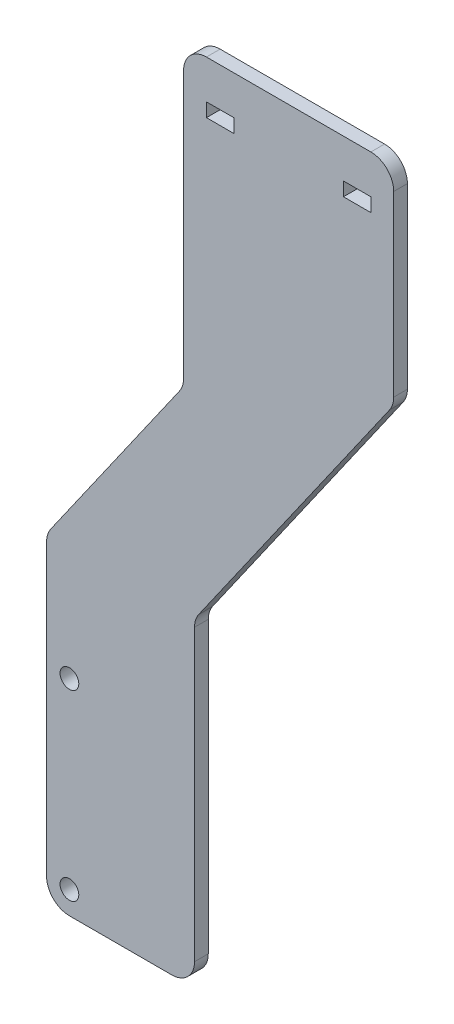
ISO-10303-21;
HEADER;
FILE_DESCRIPTION(('STEP AP214'),'2;1');
FILE_NAME('part.step','',(''),(''),'','','');
FILE_SCHEMA(('AUTOMOTIVE_DESIGN { 1 0 10303 214 1 1 1 1 }'));
ENDSEC;
DATA;
#1=APPLICATION_CONTEXT('core data for automotive mechanical design processes');
#2=APPLICATION_PROTOCOL_DEFINITION('international standard','automotive_design',2000,#1);
#3=PRODUCT_CONTEXT('',#1,'mechanical');
#4=PRODUCT('Part','Part','',(#3));
#5=PRODUCT_RELATED_PRODUCT_CATEGORY('part','',(#4));
#6=PRODUCT_DEFINITION_FORMATION('','',#4);
#7=PRODUCT_DEFINITION_CONTEXT('part definition',#1,'design');
#8=PRODUCT_DEFINITION('design','',#6,#7);
#9=PRODUCT_DEFINITION_SHAPE('','',#8);
#10=(LENGTH_UNIT() NAMED_UNIT(*) SI_UNIT(.MILLI.,.METRE.));
#11=(NAMED_UNIT(*) PLANE_ANGLE_UNIT() SI_UNIT($,.RADIAN.));
#12=(NAMED_UNIT(*) SI_UNIT($,.STERADIAN.) SOLID_ANGLE_UNIT());
#13=UNCERTAINTY_MEASURE_WITH_UNIT(LENGTH_MEASURE(1.E-05),#10,'distance_accuracy_value','');
#14=(GEOMETRIC_REPRESENTATION_CONTEXT(3) GLOBAL_UNCERTAINTY_ASSIGNED_CONTEXT((#13)) GLOBAL_UNIT_ASSIGNED_CONTEXT((#10,
#11,#12)) REPRESENTATION_CONTEXT('',''));
#15=CARTESIAN_POINT('',(0.,0.,0.));
#16=DIRECTION('',(0.,0.,1.));
#17=DIRECTION('',(1.,0.,0.));
#18=AXIS2_PLACEMENT_3D('',#15,#16,#17);
#19=CARTESIAN_POINT('',(0.,0.,3.));
#20=DIRECTION('',(0.,0.,-1.));
#21=DIRECTION('',(-1.,0.,0.));
#22=AXIS2_PLACEMENT_3D('',#19,#20,#21);
#23=PLANE('',#22);
#24=DIRECTION('',(0.,1.,0.));
#25=VECTOR('',#24,1.);
#26=CARTESIAN_POINT('',(-5.00000000000006,158.5,3.));
#27=LINE('',#26,#25);
#28=CARTESIAN_POINT('',(-5.00000000000006,155.5,3.));
#29=VERTEX_POINT('',#28);
#30=CARTESIAN_POINT('',(-5.00000000000006,158.5,3.));
#31=VERTEX_POINT('',#30);
#32=EDGE_CURVE('E237',#29,#31,#27,.T.);
#33=ORIENTED_EDGE('',*,*,#32,.F.);
#34=DIRECTION('',(1.,0.,0.));
#35=VECTOR('',#34,1.);
#36=CARTESIAN_POINT('',(-11.0000000000001,155.5,3.));
#37=LINE('',#36,#35);
#38=CARTESIAN_POINT('',(-11.0000000000001,155.5,3.));
#39=VERTEX_POINT('',#38);
#40=EDGE_CURVE('E245',#39,#29,#37,.T.);
#41=ORIENTED_EDGE('',*,*,#40,.F.);
#42=DIRECTION('',(0.,-1.,0.));
#43=VECTOR('',#42,1.);
#44=CARTESIAN_POINT('',(-11.0000000000001,158.5,3.));
#45=LINE('',#44,#43);
#46=CARTESIAN_POINT('',(-11.0000000000001,158.5,3.));
#47=VERTEX_POINT('',#46);
#48=EDGE_CURVE('E242',#47,#39,#45,.T.);
#49=ORIENTED_EDGE('',*,*,#48,.F.);
#50=DIRECTION('',(-1.,0.,0.));
#51=VECTOR('',#50,1.);
#52=CARTESIAN_POINT('',(-11.0000000000001,158.5,3.));
#53=LINE('',#52,#51);
#54=EDGE_CURVE('E239',#31,#47,#53,.T.);
#55=ORIENTED_EDGE('',*,*,#54,.F.);
#56=EDGE_LOOP('',(#33,#41,#49,#55));
#57=FACE_BOUND('',#56,.T.);
#58=DIRECTION('',(0.573576436351041,0.819152044288995,0.));
#59=VECTOR('',#58,1.);
#60=CARTESIAN_POINT('',(-43.6038327108647,59.155559797736,3.));
#61=LINE('',#60,#59);
#62=CARTESIAN_POINT('',(-42.6995929323097,60.4469480350963,3.));
#63=VERTEX_POINT('',#62);
#64=CARTESIAN_POINT('',(-0.904239778555069,120.136898332715,3.));
#65=VERTEX_POINT('',#64);
#66=EDGE_CURVE('E280',#63,#65,#61,.T.);
#67=ORIENTED_EDGE('',*,*,#66,.T.);
#68=CARTESIAN_POINT('',(-5.00000000000004,123.00478051447,3.));
#69=DIRECTION('',(0.,0.,-1.));
#70=DIRECTION('',(-1.,0.,0.));
#71=AXIS2_PLACEMENT_3D('',#68,#69,#70);
#72=CIRCLE('',#71,5.);
#73=CARTESIAN_POINT('',(0.,123.00478051447,3.));
#74=VERTEX_POINT('',#73);
#75=EDGE_CURVE('E360',#65,#74,#72,.F.);
#76=ORIENTED_EDGE('',*,*,#75,.T.);
#77=DIRECTION('',(0.,1.,0.));
#78=VECTOR('',#77,1.);
#79=CARTESIAN_POINT('',(0.,167.,3.));
#80=LINE('',#79,#78);
#81=CARTESIAN_POINT('',(0.,162.,3.));
#82=VERTEX_POINT('',#81);
#83=EDGE_CURVE('E283',#74,#82,#80,.T.);
#84=ORIENTED_EDGE('',*,*,#83,.T.);
#85=CARTESIAN_POINT('',(-5.00000000000005,162.,3.));
#86=DIRECTION('',(0.,0.,-1.));
#87=DIRECTION('',(-1.,0.,0.));
#88=AXIS2_PLACEMENT_3D('',#85,#86,#87);
#89=CIRCLE('',#88,5.);
#90=CARTESIAN_POINT('',(-5.00000000000005,167.,3.));
#91=VERTEX_POINT('',#90);
#92=EDGE_CURVE('E352',#82,#91,#89,.F.);
#93=ORIENTED_EDGE('',*,*,#92,.T.);
#94=DIRECTION('',(-1.,0.,0.));
#95=VECTOR('',#94,1.);
#96=CARTESIAN_POINT('',(-46.0000000000001,167.,3.));
#97=LINE('',#96,#95);
#98=CARTESIAN_POINT('',(-41.0000000000001,167.,3.));
#99=VERTEX_POINT('',#98);
#100=EDGE_CURVE('E287',#91,#99,#97,.T.);
#101=ORIENTED_EDGE('',*,*,#100,.T.);
#102=CARTESIAN_POINT('',(-41.0000000000001,162.,3.));
#103=DIRECTION('',(0.,0.,-1.));
#104=DIRECTION('',(-1.,0.,0.));
#105=AXIS2_PLACEMENT_3D('',#102,#103,#104);
#106=CIRCLE('',#105,5.);
#107=CARTESIAN_POINT('',(-46.0000000000001,162.,3.));
#108=VERTEX_POINT('',#107);
#109=EDGE_CURVE('E354',#99,#108,#106,.F.);
#110=ORIENTED_EDGE('',*,*,#109,.T.);
#111=DIRECTION('',(0.,-1.,0.));
#112=VECTOR('',#111,1.);
#113=CARTESIAN_POINT('',(-46.0000000000001,102.,3.));
#114=LINE('',#113,#112);
#115=CARTESIAN_POINT('',(-46.0000000000001,103.576493944395,3.));
#116=VERTEX_POINT('',#115);
#117=EDGE_CURVE('E290',#108,#116,#114,.T.);
#118=ORIENTED_EDGE('',*,*,#117,.T.);
#119=CARTESIAN_POINT('',(-51.,103.576493944395,3.));
#120=DIRECTION('',(0.,0.,-1.));
#121=DIRECTION('',(-1.,0.,0.));
#122=AXIS2_PLACEMENT_3D('',#119,#120,#121);
#123=CIRCLE('',#122,5.);
#124=CARTESIAN_POINT('',(-46.9042397785551,100.70861176264,3.));
#125=VERTEX_POINT('',#124);
#126=EDGE_CURVE('E11',#116,#125,#123,.T.);
#127=ORIENTED_EDGE('',*,*,#126,.T.);
#128=DIRECTION('',(-0.573576436351041,-0.819152044288995,0.));
#129=VECTOR('',#128,1.);
#130=CARTESIAN_POINT('',(-46.0000000000001,102.,3.));
#131=LINE('',#130,#129);
#132=CARTESIAN_POINT('',(-75.095760221445,60.4469480350963,3.));
#133=VERTEX_POINT('',#132);
#134=EDGE_CURVE('E293',#125,#133,#131,.T.);
#135=ORIENTED_EDGE('',*,*,#134,.T.);
#136=CARTESIAN_POINT('',(-71.0000000000001,57.5790658533411,3.));
#137=DIRECTION('',(0.,0.,-1.));
#138=DIRECTION('',(-1.,0.,0.));
#139=AXIS2_PLACEMENT_3D('',#136,#137,#138);
#140=CIRCLE('',#139,5.);
#141=CARTESIAN_POINT('',(-76.0000000000001,57.5790658533411,3.));
#142=VERTEX_POINT('',#141);
#143=EDGE_CURVE('E356',#133,#142,#140,.F.);
#144=ORIENTED_EDGE('',*,*,#143,.T.);
#145=DIRECTION('',(0.,-1.,0.));
#146=VECTOR('',#145,1.);
#147=CARTESIAN_POINT('',(-76.0000000000001,-10.844440202264,3.));
#148=LINE('',#147,#146);
#149=CARTESIAN_POINT('',(-76.0000000000001,-5.84444020226398,3.));
#150=VERTEX_POINT('',#149);
#151=EDGE_CURVE('E296',#142,#150,#148,.T.);
#152=ORIENTED_EDGE('',*,*,#151,.T.);
#153=CARTESIAN_POINT('',(-71.0000000000001,-5.84444020226398,3.));
#154=DIRECTION('',(0.,0.,-1.));
#155=DIRECTION('',(-1.,0.,0.));
#156=AXIS2_PLACEMENT_3D('',#153,#154,#155);
#157=CIRCLE('',#156,5.);
#158=CARTESIAN_POINT('',(-71.0000000000001,-10.844440202264,3.));
#159=VERTEX_POINT('',#158);
#160=EDGE_CURVE('E55',#150,#159,#157,.F.);
#161=ORIENTED_EDGE('',*,*,#160,.T.);
#162=DIRECTION('',(1.,0.,0.));
#163=VECTOR('',#162,1.);
#164=CARTESIAN_POINT('',(-43.6038327108647,-10.844440202264,3.));
#165=LINE('',#164,#163);
#166=CARTESIAN_POINT('',(-48.6038327108647,-10.844440202264,3.));
#167=VERTEX_POINT('',#166);
#168=EDGE_CURVE('E298',#159,#167,#165,.T.);
#169=ORIENTED_EDGE('',*,*,#168,.T.);
#170=CARTESIAN_POINT('',(-48.6038327108647,-5.84444020226398,3.));
#171=DIRECTION('',(0.,0.,-1.));
#172=DIRECTION('',(-1.,0.,0.));
#173=AXIS2_PLACEMENT_3D('',#170,#171,#172);
#174=CIRCLE('',#173,5.);
#175=CARTESIAN_POINT('',(-43.6038327108647,-5.84444020226398,3.));
#176=VERTEX_POINT('',#175);
#177=EDGE_CURVE('E358',#167,#176,#174,.F.);
#178=ORIENTED_EDGE('',*,*,#177,.T.);
#179=DIRECTION('',(0.,1.,0.));
#180=VECTOR('',#179,1.);
#181=CARTESIAN_POINT('',(-43.6038327108647,39.7272732276612,3.));
#182=LINE('',#181,#180);
#183=CARTESIAN_POINT('',(-43.6038327108647,57.5790658533411,3.));
#184=VERTEX_POINT('',#183);
#185=EDGE_CURVE('E300',#176,#184,#182,.T.);
#186=ORIENTED_EDGE('',*,*,#185,.T.);
#187=CARTESIAN_POINT('',(-38.6038327108647,57.5790658533411,3.));
#188=DIRECTION('',(0.,0.,-1.));
#189=DIRECTION('',(-1.,0.,0.));
#190=AXIS2_PLACEMENT_3D('',#187,#188,#189);
#191=CIRCLE('',#190,5.);
#192=EDGE_CURVE('E388',#184,#63,#191,.T.);
#193=ORIENTED_EDGE('',*,*,#192,.T.);
#194=EDGE_LOOP('',(#67,#76,#84,#93,#101,#110,#118,#127,#135,#144,#152,#161,#169,#178,#186,#193));
#195=FACE_BOUND('',#194,.T.);
#196=CARTESIAN_POINT('',(-71.,34.155559797736,3.));
#197=DIRECTION('',(0.,0.,1.));
#198=DIRECTION('',(1.,0.,0.));
#199=AXIS2_PLACEMENT_3D('',#196,#197,#198);
#200=CIRCLE('',#199,2.04999999999999);
#201=CARTESIAN_POINT('',(-68.9500000000001,34.155559797736,3.));
#202=VERTEX_POINT('',#201);
#203=EDGE_CURVE('E274',#202,#202,#200,.T.);
#204=ORIENTED_EDGE('',*,*,#203,.F.);
#205=EDGE_LOOP('',(#204));
#206=FACE_BOUND('',#205,.T.);
#207=CARTESIAN_POINT('',(-71.0000000000001,-5.84444020226398,3.));
#208=DIRECTION('',(0.,0.,1.));
#209=DIRECTION('',(1.,0.,0.));
#210=AXIS2_PLACEMENT_3D('',#207,#208,#209);
#211=CIRCLE('',#210,2.05000000000001);
#212=CARTESIAN_POINT('',(-68.9500000000001,-5.84444020226398,3.));
#213=VERTEX_POINT('',#212);
#214=EDGE_CURVE('E268',#213,#213,#211,.T.);
#215=ORIENTED_EDGE('',*,*,#214,.F.);
#216=EDGE_LOOP('',(#215));
#217=FACE_BOUND('',#216,.T.);
#218=DIRECTION('',(-1.,0.,0.));
#219=VECTOR('',#218,1.);
#220=CARTESIAN_POINT('',(-35.0000000000001,158.5,3.));
#221=LINE('',#220,#219);
#222=CARTESIAN_POINT('',(-35.0000000000001,158.5,3.));
#223=VERTEX_POINT('',#222);
#224=CARTESIAN_POINT('',(-41.0000000000001,158.5,3.));
#225=VERTEX_POINT('',#224);
#226=EDGE_CURVE('E196',#223,#225,#221,.T.);
#227=ORIENTED_EDGE('',*,*,#226,.F.);
#228=DIRECTION('',(0.,1.,0.));
#229=VECTOR('',#228,1.);
#230=CARTESIAN_POINT('',(-35.0000000000001,158.5,3.));
#231=LINE('',#230,#229);
#232=CARTESIAN_POINT('',(-35.0000000000001,155.5,3.));
#233=VERTEX_POINT('',#232);
#234=EDGE_CURVE('E221',#233,#223,#231,.T.);
#235=ORIENTED_EDGE('',*,*,#234,.F.);
#236=DIRECTION('',(1.,0.,0.));
#237=VECTOR('',#236,1.);
#238=CARTESIAN_POINT('',(-35.0000000000001,155.5,3.));
#239=LINE('',#238,#237);
#240=CARTESIAN_POINT('',(-41.,155.5,3.));
#241=VERTEX_POINT('',#240);
#242=EDGE_CURVE('E219',#241,#233,#239,.T.);
#243=ORIENTED_EDGE('',*,*,#242,.F.);
#244=DIRECTION('',(0.,-1.,0.));
#245=VECTOR('',#244,1.);
#246=CARTESIAN_POINT('',(-41.0000000000001,158.5,3.));
#247=LINE('',#246,#245);
#248=EDGE_CURVE('E206',#225,#241,#247,.T.);
#249=ORIENTED_EDGE('',*,*,#248,.F.);
#250=EDGE_LOOP('',(#227,#235,#243,#249));
#251=FACE_BOUND('',#250,.T.);
#252=ADVANCED_FACE('F33',(#57,#195,#206,#217,#251),#23,.F.);
#253=CARTESIAN_POINT('',(0.,0.,0.));
#254=DIRECTION('',(0.,0.,-1.));
#255=DIRECTION('',(-1.,0.,0.));
#256=AXIS2_PLACEMENT_3D('',#253,#254,#255);
#257=PLANE('',#256);
#258=CARTESIAN_POINT('',(-71.,34.155559797736,0.));
#259=DIRECTION('',(0.,0.,1.));
#260=DIRECTION('',(1.,0.,0.));
#261=AXIS2_PLACEMENT_3D('',#258,#259,#260);
#262=CIRCLE('',#261,2.04999999999999);
#263=CARTESIAN_POINT('',(-68.9500000000001,34.155559797736,0.));
#264=VERTEX_POINT('',#263);
#265=EDGE_CURVE('E271',#264,#264,#262,.T.);
#266=ORIENTED_EDGE('',*,*,#265,.T.);
#267=EDGE_LOOP('',(#266));
#268=FACE_BOUND('',#267,.T.);
#269=DIRECTION('',(0.,1.,0.));
#270=VECTOR('',#269,1.);
#271=CARTESIAN_POINT('',(0.,167.,0.));
#272=LINE('',#271,#270);
#273=CARTESIAN_POINT('',(0.,123.00478051447,0.));
#274=VERTEX_POINT('',#273);
#275=CARTESIAN_POINT('',(0.,162.,0.));
#276=VERTEX_POINT('',#275);
#277=EDGE_CURVE('E306',#274,#276,#272,.T.);
#278=ORIENTED_EDGE('',*,*,#277,.F.);
#279=CARTESIAN_POINT('',(-5.00000000000004,123.00478051447,0.));
#280=DIRECTION('',(0.,0.,-1.));
#281=DIRECTION('',(-1.,0.,0.));
#282=AXIS2_PLACEMENT_3D('',#279,#280,#281);
#283=CIRCLE('',#282,5.);
#284=CARTESIAN_POINT('',(-0.904239778555069,120.136898332715,0.));
#285=VERTEX_POINT('',#284);
#286=EDGE_CURVE('E349',#274,#285,#283,.T.);
#287=ORIENTED_EDGE('',*,*,#286,.T.);
#288=DIRECTION('',(0.573576436351041,0.819152044288995,0.));
#289=VECTOR('',#288,1.);
#290=CARTESIAN_POINT('',(-43.6038327108647,59.155559797736,0.));
#291=LINE('',#290,#289);
#292=CARTESIAN_POINT('',(-42.6995929323097,60.4469480350963,0.));
#293=VERTEX_POINT('',#292);
#294=EDGE_CURVE('E277',#293,#285,#291,.T.);
#295=ORIENTED_EDGE('',*,*,#294,.F.);
#296=CARTESIAN_POINT('',(-38.6038327108647,57.5790658533411,0.));
#297=DIRECTION('',(0.,0.,-1.));
#298=DIRECTION('',(-1.,0.,0.));
#299=AXIS2_PLACEMENT_3D('',#296,#297,#298);
#300=CIRCLE('',#299,5.);
#301=CARTESIAN_POINT('',(-43.6038327108647,57.5790658533411,0.));
#302=VERTEX_POINT('',#301);
#303=EDGE_CURVE('E386',#293,#302,#300,.F.);
#304=ORIENTED_EDGE('',*,*,#303,.T.);
#305=DIRECTION('',(0.,1.,0.));
#306=VECTOR('',#305,1.);
#307=CARTESIAN_POINT('',(-43.6038327108647,39.7272732276612,0.));
#308=LINE('',#307,#306);
#309=CARTESIAN_POINT('',(-43.6038327108647,-5.84444020226398,0.));
#310=VERTEX_POINT('',#309);
#311=EDGE_CURVE('E284',#310,#302,#308,.T.);
#312=ORIENTED_EDGE('',*,*,#311,.F.);
#313=CARTESIAN_POINT('',(-48.6038327108647,-5.84444020226398,0.));
#314=DIRECTION('',(0.,0.,-1.));
#315=DIRECTION('',(-1.,0.,0.));
#316=AXIS2_PLACEMENT_3D('',#313,#314,#315);
#317=CIRCLE('',#316,5.);
#318=CARTESIAN_POINT('',(-48.6038327108647,-10.844440202264,0.));
#319=VERTEX_POINT('',#318);
#320=EDGE_CURVE('E347',#310,#319,#317,.T.);
#321=ORIENTED_EDGE('',*,*,#320,.T.);
#322=DIRECTION('',(1.,0.,0.));
#323=VECTOR('',#322,1.);
#324=CARTESIAN_POINT('',(-43.6038327108647,-10.844440202264,0.));
#325=LINE('',#324,#323);
#326=CARTESIAN_POINT('',(-71.0000000000001,-10.844440202264,0.));
#327=VERTEX_POINT('',#326);
#328=EDGE_CURVE('E321',#327,#319,#325,.T.);
#329=ORIENTED_EDGE('',*,*,#328,.F.);
#330=CARTESIAN_POINT('',(-71.0000000000001,-5.84444020226398,0.));
#331=DIRECTION('',(0.,0.,-1.));
#332=DIRECTION('',(-1.,0.,0.));
#333=AXIS2_PLACEMENT_3D('',#330,#331,#332);
#334=CIRCLE('',#333,5.);
#335=CARTESIAN_POINT('',(-76.0000000000001,-5.84444020226398,0.));
#336=VERTEX_POINT('',#335);
#337=EDGE_CURVE('E339',#327,#336,#334,.T.);
#338=ORIENTED_EDGE('',*,*,#337,.T.);
#339=DIRECTION('',(0.,-1.,0.));
#340=VECTOR('',#339,1.);
#341=CARTESIAN_POINT('',(-76.0000000000001,-10.844440202264,0.));
#342=LINE('',#341,#340);
#343=CARTESIAN_POINT('',(-76.0000000000001,57.5790658533411,0.));
#344=VERTEX_POINT('',#343);
#345=EDGE_CURVE('E318',#344,#336,#342,.T.);
#346=ORIENTED_EDGE('',*,*,#345,.F.);
#347=CARTESIAN_POINT('',(-71.0000000000001,57.5790658533411,0.));
#348=DIRECTION('',(0.,0.,-1.));
#349=DIRECTION('',(-1.,0.,0.));
#350=AXIS2_PLACEMENT_3D('',#347,#348,#349);
#351=CIRCLE('',#350,5.);
#352=CARTESIAN_POINT('',(-75.095760221445,60.4469480350963,0.));
#353=VERTEX_POINT('',#352);
#354=EDGE_CURVE('E345',#344,#353,#351,.T.);
#355=ORIENTED_EDGE('',*,*,#354,.T.);
#356=DIRECTION('',(-0.573576436351041,-0.819152044288995,0.));
#357=VECTOR('',#356,1.);
#358=CARTESIAN_POINT('',(-46.0000000000001,102.,0.));
#359=LINE('',#358,#357);
#360=CARTESIAN_POINT('',(-46.9042397785551,100.70861176264,0.));
#361=VERTEX_POINT('',#360);
#362=EDGE_CURVE('E315',#361,#353,#359,.T.);
#363=ORIENTED_EDGE('',*,*,#362,.F.);
#364=CARTESIAN_POINT('',(-51.,103.576493944395,0.));
#365=DIRECTION('',(0.,0.,-1.));
#366=DIRECTION('',(-1.,0.,0.));
#367=AXIS2_PLACEMENT_3D('',#364,#365,#366);
#368=CIRCLE('',#367,5.);
#369=CARTESIAN_POINT('',(-46.0000000000001,103.576493944395,0.));
#370=VERTEX_POINT('',#369);
#371=EDGE_CURVE('E41',#361,#370,#368,.F.);
#372=ORIENTED_EDGE('',*,*,#371,.T.);
#373=DIRECTION('',(0.,-1.,0.));
#374=VECTOR('',#373,1.);
#375=CARTESIAN_POINT('',(-46.0000000000001,102.,0.));
#376=LINE('',#375,#374);
#377=CARTESIAN_POINT('',(-46.0000000000001,162.,0.));
#378=VERTEX_POINT('',#377);
#379=EDGE_CURVE('E312',#378,#370,#376,.T.);
#380=ORIENTED_EDGE('',*,*,#379,.F.);
#381=CARTESIAN_POINT('',(-41.0000000000001,162.,0.));
#382=DIRECTION('',(0.,0.,-1.));
#383=DIRECTION('',(-1.,0.,0.));
#384=AXIS2_PLACEMENT_3D('',#381,#382,#383);
#385=CIRCLE('',#384,5.);
#386=CARTESIAN_POINT('',(-41.0000000000001,167.,0.));
#387=VERTEX_POINT('',#386);
#388=EDGE_CURVE('E343',#378,#387,#385,.T.);
#389=ORIENTED_EDGE('',*,*,#388,.T.);
#390=DIRECTION('',(-1.,0.,0.));
#391=VECTOR('',#390,1.);
#392=CARTESIAN_POINT('',(-46.0000000000001,167.,0.));
#393=LINE('',#392,#391);
#394=CARTESIAN_POINT('',(-5.00000000000005,167.,0.));
#395=VERTEX_POINT('',#394);
#396=EDGE_CURVE('E309',#395,#387,#393,.T.);
#397=ORIENTED_EDGE('',*,*,#396,.F.);
#398=CARTESIAN_POINT('',(-5.00000000000005,162.,0.));
#399=DIRECTION('',(0.,0.,-1.));
#400=DIRECTION('',(-1.,0.,0.));
#401=AXIS2_PLACEMENT_3D('',#398,#399,#400);
#402=CIRCLE('',#401,5.);
#403=EDGE_CURVE('E341',#395,#276,#402,.T.);
#404=ORIENTED_EDGE('',*,*,#403,.T.);
#405=EDGE_LOOP('',(#278,#287,#295,#304,#312,#321,#329,#338,#346,#355,#363,#372,#380,#389,#397,#404));
#406=FACE_BOUND('',#405,.T.);
#407=CARTESIAN_POINT('',(-71.0000000000001,-5.84444020226398,0.));
#408=DIRECTION('',(0.,0.,1.));
#409=DIRECTION('',(1.,0.,0.));
#410=AXIS2_PLACEMENT_3D('',#407,#408,#409);
#411=CIRCLE('',#410,2.05000000000001);
#412=CARTESIAN_POINT('',(-68.9500000000001,-5.84444020226398,0.));
#413=VERTEX_POINT('',#412);
#414=EDGE_CURVE('E267',#413,#413,#411,.T.);
#415=ORIENTED_EDGE('',*,*,#414,.T.);
#416=EDGE_LOOP('',(#415));
#417=FACE_BOUND('',#416,.T.);
#418=DIRECTION('',(1.,0.,0.));
#419=VECTOR('',#418,1.);
#420=CARTESIAN_POINT('',(-11.0000000000001,155.5,0.));
#421=LINE('',#420,#419);
#422=CARTESIAN_POINT('',(-11.0000000000001,155.5,0.));
#423=VERTEX_POINT('',#422);
#424=CARTESIAN_POINT('',(-5.00000000000006,155.5,0.));
#425=VERTEX_POINT('',#424);
#426=EDGE_CURVE('E240',#423,#425,#421,.T.);
#427=ORIENTED_EDGE('',*,*,#426,.T.);
#428=DIRECTION('',(0.,1.,0.));
#429=VECTOR('',#428,1.);
#430=CARTESIAN_POINT('',(-5.00000000000006,158.5,0.));
#431=LINE('',#430,#429);
#432=CARTESIAN_POINT('',(-5.00000000000006,158.5,0.));
#433=VERTEX_POINT('',#432);
#434=EDGE_CURVE('E214',#425,#433,#431,.T.);
#435=ORIENTED_EDGE('',*,*,#434,.T.);
#436=DIRECTION('',(-1.,0.,0.));
#437=VECTOR('',#436,1.);
#438=CARTESIAN_POINT('',(-11.0000000000001,158.5,0.));
#439=LINE('',#438,#437);
#440=CARTESIAN_POINT('',(-11.0000000000001,158.5,0.));
#441=VERTEX_POINT('',#440);
#442=EDGE_CURVE('E250',#433,#441,#439,.T.);
#443=ORIENTED_EDGE('',*,*,#442,.T.);
#444=DIRECTION('',(0.,-1.,0.));
#445=VECTOR('',#444,1.);
#446=CARTESIAN_POINT('',(-11.0000000000001,158.5,0.));
#447=LINE('',#446,#445);
#448=EDGE_CURVE('E253',#441,#423,#447,.T.);
#449=ORIENTED_EDGE('',*,*,#448,.T.);
#450=EDGE_LOOP('',(#427,#435,#443,#449));
#451=FACE_BOUND('',#450,.T.);
#452=DIRECTION('',(0.,1.,0.));
#453=VECTOR('',#452,1.);
#454=CARTESIAN_POINT('',(-35.0000000000001,158.5,0.));
#455=LINE('',#454,#453);
#456=CARTESIAN_POINT('',(-35.0000000000001,155.5,0.));
#457=VERTEX_POINT('',#456);
#458=CARTESIAN_POINT('',(-35.0000000000001,158.5,0.));
#459=VERTEX_POINT('',#458);
#460=EDGE_CURVE('E207',#457,#459,#455,.T.);
#461=ORIENTED_EDGE('',*,*,#460,.T.);
#462=DIRECTION('',(-1.,0.,0.));
#463=VECTOR('',#462,1.);
#464=CARTESIAN_POINT('',(-35.0000000000001,158.5,0.));
#465=LINE('',#464,#463);
#466=CARTESIAN_POINT('',(-41.0000000000001,158.5,0.));
#467=VERTEX_POINT('',#466);
#468=EDGE_CURVE('E225',#459,#467,#465,.T.);
#469=ORIENTED_EDGE('',*,*,#468,.T.);
#470=DIRECTION('',(0.,-1.,0.));
#471=VECTOR('',#470,1.);
#472=CARTESIAN_POINT('',(-41.0000000000001,158.5,0.));
#473=LINE('',#472,#471);
#474=CARTESIAN_POINT('',(-41.,155.5,0.));
#475=VERTEX_POINT('',#474);
#476=EDGE_CURVE('E213',#467,#475,#473,.T.);
#477=ORIENTED_EDGE('',*,*,#476,.T.);
#478=DIRECTION('',(1.,0.,0.));
#479=VECTOR('',#478,1.);
#480=CARTESIAN_POINT('',(-35.0000000000001,155.5,0.));
#481=LINE('',#480,#479);
#482=EDGE_CURVE('E228',#475,#457,#481,.T.);
#483=ORIENTED_EDGE('',*,*,#482,.T.);
#484=EDGE_LOOP('',(#461,#469,#477,#483));
#485=FACE_BOUND('',#484,.T.);
#486=ADVANCED_FACE('F393',(#268,#406,#417,#451,#485),#257,.T.);
#487=CARTESIAN_POINT('',(-43.6038327108647,59.155559797736,3.));
#488=DIRECTION('',(-0.819152044288995,0.573576436351041,0.));
#489=DIRECTION('',(-0.573576436351041,-0.819152044288995,0.));
#490=AXIS2_PLACEMENT_3D('',#487,#488,#489);
#491=PLANE('',#490);
#492=ORIENTED_EDGE('',*,*,#66,.F.);
#493=DIRECTION('',(0.,0.,-1.));
#494=VECTOR('',#493,1.);
#495=CARTESIAN_POINT('',(-42.6995929323097,60.4469480350963,0.));
#496=LINE('',#495,#494);
#497=EDGE_CURVE('E326',#63,#293,#496,.T.);
#498=ORIENTED_EDGE('',*,*,#497,.T.);
#499=ORIENTED_EDGE('',*,*,#294,.T.);
#500=DIRECTION('',(0.,0.,-1.));
#501=VECTOR('',#500,1.);
#502=CARTESIAN_POINT('',(-0.904239778555069,120.136898332715,3.));
#503=LINE('',#502,#501);
#504=EDGE_CURVE('E303',#285,#65,#503,.F.);
#505=ORIENTED_EDGE('',*,*,#504,.T.);
#506=EDGE_LOOP('',(#492,#498,#499,#505));
#507=FACE_BOUND('',#506,.T.);
#508=ADVANCED_FACE('F438',(#507),#491,.F.);
#509=CARTESIAN_POINT('',(0.,167.,3.));
#510=DIRECTION('',(-1.,0.,0.));
#511=DIRECTION('',(0.,-1.,0.));
#512=AXIS2_PLACEMENT_3D('',#509,#510,#511);
#513=PLANE('',#512);
#514=ORIENTED_EDGE('',*,*,#83,.F.);
#515=DIRECTION('',(0.,0.,-1.));
#516=VECTOR('',#515,1.);
#517=CARTESIAN_POINT('',(0.,123.00478051447,3.));
#518=LINE('',#517,#516);
#519=EDGE_CURVE('E336',#74,#274,#518,.T.);
#520=ORIENTED_EDGE('',*,*,#519,.T.);
#521=ORIENTED_EDGE('',*,*,#277,.T.);
#522=DIRECTION('',(0.,0.,-1.));
#523=VECTOR('',#522,1.);
#524=CARTESIAN_POINT('',(0.,162.,3.));
#525=LINE('',#524,#523);
#526=EDGE_CURVE('E334',#276,#82,#525,.F.);
#527=ORIENTED_EDGE('',*,*,#526,.T.);
#528=EDGE_LOOP('',(#514,#520,#521,#527));
#529=FACE_BOUND('',#528,.T.);
#530=ADVANCED_FACE('F446',(#529),#513,.F.);
#531=CARTESIAN_POINT('',(-46.0000000000001,167.,3.));
#532=DIRECTION('',(0.,-1.,0.));
#533=DIRECTION('',(0.,0.,-1.));
#534=AXIS2_PLACEMENT_3D('',#531,#532,#533);
#535=PLANE('',#534);
#536=ORIENTED_EDGE('',*,*,#396,.T.);
#537=DIRECTION('',(0.,0.,-1.));
#538=VECTOR('',#537,1.);
#539=CARTESIAN_POINT('',(-41.0000000000001,167.,3.));
#540=LINE('',#539,#538);
#541=EDGE_CURVE('E384',#387,#99,#540,.F.);
#542=ORIENTED_EDGE('',*,*,#541,.T.);
#543=ORIENTED_EDGE('',*,*,#100,.F.);
#544=DIRECTION('',(0.,0.,-1.));
#545=VECTOR('',#544,1.);
#546=CARTESIAN_POINT('',(-5.00000000000005,167.,3.));
#547=LINE('',#546,#545);
#548=EDGE_CURVE('E381',#91,#395,#547,.T.);
#549=ORIENTED_EDGE('',*,*,#548,.T.);
#550=EDGE_LOOP('',(#536,#542,#543,#549));
#551=FACE_BOUND('',#550,.T.);
#552=ADVANCED_FACE('F455',(#551),#535,.F.);
#553=CARTESIAN_POINT('',(-46.0000000000001,102.,3.));
#554=DIRECTION('',(1.,0.,0.));
#555=DIRECTION('',(0.,0.,-1.));
#556=AXIS2_PLACEMENT_3D('',#553,#554,#555);
#557=PLANE('',#556);
#558=ORIENTED_EDGE('',*,*,#379,.T.);
#559=DIRECTION('',(0.,0.,-1.));
#560=VECTOR('',#559,1.);
#561=CARTESIAN_POINT('',(-46.0000000000001,103.576493944395,3.));
#562=LINE('',#561,#560);
#563=EDGE_CURVE('E374',#370,#116,#562,.F.);
#564=ORIENTED_EDGE('',*,*,#563,.T.);
#565=ORIENTED_EDGE('',*,*,#117,.F.);
#566=DIRECTION('',(0.,0.,-1.));
#567=VECTOR('',#566,1.);
#568=CARTESIAN_POINT('',(-46.0000000000001,162.,3.));
#569=LINE('',#568,#567);
#570=EDGE_CURVE('E371',#108,#378,#569,.T.);
#571=ORIENTED_EDGE('',*,*,#570,.T.);
#572=EDGE_LOOP('',(#558,#564,#565,#571));
#573=FACE_BOUND('',#572,.T.);
#574=ADVANCED_FACE('F399',(#573),#557,.F.);
#575=CARTESIAN_POINT('',(-46.0000000000001,102.,3.));
#576=DIRECTION('',(0.819152044288995,-0.573576436351041,0.));
#577=DIRECTION('',(0.573576436351041,0.819152044288995,0.));
#578=AXIS2_PLACEMENT_3D('',#575,#576,#577);
#579=PLANE('',#578);
#580=ORIENTED_EDGE('',*,*,#134,.F.);
#581=DIRECTION('',(0.,0.,-1.));
#582=VECTOR('',#581,1.);
#583=CARTESIAN_POINT('',(-46.9042397785551,100.70861176264,0.));
#584=LINE('',#583,#582);
#585=EDGE_CURVE('E368',#125,#361,#584,.T.);
#586=ORIENTED_EDGE('',*,*,#585,.T.);
#587=ORIENTED_EDGE('',*,*,#362,.T.);
#588=DIRECTION('',(0.,0.,-1.));
#589=VECTOR('',#588,1.);
#590=CARTESIAN_POINT('',(-75.095760221445,60.4469480350963,3.));
#591=LINE('',#590,#589);
#592=EDGE_CURVE('E366',#353,#133,#591,.F.);
#593=ORIENTED_EDGE('',*,*,#592,.T.);
#594=EDGE_LOOP('',(#580,#586,#587,#593));
#595=FACE_BOUND('',#594,.T.);
#596=ADVANCED_FACE('F408',(#595),#579,.F.);
#597=CARTESIAN_POINT('',(-76.0000000000001,-10.844440202264,3.));
#598=DIRECTION('',(1.,0.,0.));
#599=DIRECTION('',(0.,0.,-1.));
#600=AXIS2_PLACEMENT_3D('',#597,#598,#599);
#601=PLANE('',#600);
#602=ORIENTED_EDGE('',*,*,#151,.F.);
#603=DIRECTION('',(0.,0.,-1.));
#604=VECTOR('',#603,1.);
#605=CARTESIAN_POINT('',(-76.0000000000001,57.5790658533411,3.));
#606=LINE('',#605,#604);
#607=EDGE_CURVE('E378',#142,#344,#606,.T.);
#608=ORIENTED_EDGE('',*,*,#607,.T.);
#609=ORIENTED_EDGE('',*,*,#345,.T.);
#610=DIRECTION('',(0.,0.,-1.));
#611=VECTOR('',#610,1.);
#612=CARTESIAN_POINT('',(-76.0000000000001,-5.84444020226398,3.));
#613=LINE('',#612,#611);
#614=EDGE_CURVE('E376',#336,#150,#613,.F.);
#615=ORIENTED_EDGE('',*,*,#614,.T.);
#616=EDGE_LOOP('',(#602,#608,#609,#615));
#617=FACE_BOUND('',#616,.T.);
#618=ADVANCED_FACE('F415',(#617),#601,.F.);
#619=CARTESIAN_POINT('',(-43.6038327108647,-10.844440202264,3.));
#620=DIRECTION('',(0.,1.,0.));
#621=DIRECTION('',(-1.,0.,0.));
#622=AXIS2_PLACEMENT_3D('',#619,#620,#621);
#623=PLANE('',#622);
#624=ORIENTED_EDGE('',*,*,#328,.T.);
#625=DIRECTION('',(0.,0.,-1.));
#626=VECTOR('',#625,1.);
#627=CARTESIAN_POINT('',(-48.6038327108647,-10.844440202264,3.));
#628=LINE('',#627,#626);
#629=EDGE_CURVE('E48',#319,#167,#628,.F.);
#630=ORIENTED_EDGE('',*,*,#629,.T.);
#631=ORIENTED_EDGE('',*,*,#168,.F.);
#632=DIRECTION('',(0.,0.,-1.));
#633=VECTOR('',#632,1.);
#634=CARTESIAN_POINT('',(-71.0000000000001,-10.844440202264,3.));
#635=LINE('',#634,#633);
#636=EDGE_CURVE('E362',#159,#327,#635,.T.);
#637=ORIENTED_EDGE('',*,*,#636,.T.);
#638=EDGE_LOOP('',(#624,#630,#631,#637));
#639=FACE_BOUND('',#638,.T.);
#640=ADVANCED_FACE('F421',(#639),#623,.F.);
#641=CARTESIAN_POINT('',(-43.6038327108647,39.7272732276612,3.));
#642=DIRECTION('',(-1.,0.,0.));
#643=DIRECTION('',(0.,0.,1.));
#644=AXIS2_PLACEMENT_3D('',#641,#642,#643);
#645=PLANE('',#644);
#646=ORIENTED_EDGE('',*,*,#311,.T.);
#647=DIRECTION('',(0.,0.,-1.));
#648=VECTOR('',#647,1.);
#649=CARTESIAN_POINT('',(-43.6038327108647,57.5790658533411,3.));
#650=LINE('',#649,#648);
#651=EDGE_CURVE('E332',#302,#184,#650,.F.);
#652=ORIENTED_EDGE('',*,*,#651,.T.);
#653=ORIENTED_EDGE('',*,*,#185,.F.);
#654=DIRECTION('',(0.,0.,-1.));
#655=VECTOR('',#654,1.);
#656=CARTESIAN_POINT('',(-43.6038327108647,-5.84444020226398,3.));
#657=LINE('',#656,#655);
#658=EDGE_CURVE('E329',#176,#310,#657,.T.);
#659=ORIENTED_EDGE('',*,*,#658,.T.);
#660=EDGE_LOOP('',(#646,#652,#653,#659));
#661=FACE_BOUND('',#660,.T.);
#662=ADVANCED_FACE('F429',(#661),#645,.F.);
#663=CARTESIAN_POINT('',(-71.,34.155559797736,3.));
#664=DIRECTION('',(0.,0.,-1.));
#665=DIRECTION('',(-1.,0.,0.));
#666=AXIS2_PLACEMENT_3D('',#663,#664,#665);
#667=CYLINDRICAL_SURFACE('',#666,2.04999999999999);
#668=ORIENTED_EDGE('',*,*,#203,.T.);
#669=EDGE_LOOP('',(#668));
#670=FACE_BOUND('',#669,.T.);
#671=ORIENTED_EDGE('',*,*,#265,.F.);
#672=EDGE_LOOP('',(#671));
#673=FACE_BOUND('',#672,.T.);
#674=ADVANCED_FACE('F477',(#670,#673),#667,.F.);
#675=CARTESIAN_POINT('',(-71.0000000000001,-5.84444020226398,3.));
#676=DIRECTION('',(0.,0.,-1.));
#677=DIRECTION('',(-1.,0.,0.));
#678=AXIS2_PLACEMENT_3D('',#675,#676,#677);
#679=CYLINDRICAL_SURFACE('',#678,2.05000000000001);
#680=ORIENTED_EDGE('',*,*,#214,.T.);
#681=EDGE_LOOP('',(#680));
#682=FACE_BOUND('',#681,.T.);
#683=ORIENTED_EDGE('',*,*,#414,.F.);
#684=EDGE_LOOP('',(#683));
#685=FACE_BOUND('',#684,.T.);
#686=ADVANCED_FACE('F615',(#682,#685),#679,.F.);
#687=CARTESIAN_POINT('',(-5.00000000000006,158.5,3.));
#688=DIRECTION('',(-1.,0.,0.));
#689=DIRECTION('',(0.,-1.,0.));
#690=AXIS2_PLACEMENT_3D('',#687,#688,#689);
#691=PLANE('',#690);
#692=ORIENTED_EDGE('',*,*,#434,.F.);
#693=DIRECTION('',(0.,0.,-1.));
#694=VECTOR('',#693,1.);
#695=CARTESIAN_POINT('',(-5.00000000000006,155.5,3.));
#696=LINE('',#695,#694);
#697=EDGE_CURVE('E247',#29,#425,#696,.T.);
#698=ORIENTED_EDGE('',*,*,#697,.F.);
#699=ORIENTED_EDGE('',*,*,#32,.T.);
#700=DIRECTION('',(0.,0.,-1.));
#701=VECTOR('',#700,1.);
#702=CARTESIAN_POINT('',(-5.00000000000006,158.5,3.));
#703=LINE('',#702,#701);
#704=EDGE_CURVE('E264',#31,#433,#703,.T.);
#705=ORIENTED_EDGE('',*,*,#704,.T.);
#706=EDGE_LOOP('',(#692,#698,#699,#705));
#707=FACE_BOUND('',#706,.T.);
#708=ADVANCED_FACE('F606',(#707),#691,.T.);
#709=CARTESIAN_POINT('',(-11.0000000000001,158.5,3.));
#710=DIRECTION('',(0.,-1.,0.));
#711=DIRECTION('',(0.,0.,-1.));
#712=AXIS2_PLACEMENT_3D('',#709,#710,#711);
#713=PLANE('',#712);
#714=ORIENTED_EDGE('',*,*,#442,.F.);
#715=ORIENTED_EDGE('',*,*,#704,.F.);
#716=ORIENTED_EDGE('',*,*,#54,.T.);
#717=DIRECTION('',(0.,0.,-1.));
#718=VECTOR('',#717,1.);
#719=CARTESIAN_POINT('',(-11.0000000000001,158.5,3.));
#720=LINE('',#719,#718);
#721=EDGE_CURVE('E262',#47,#441,#720,.T.);
#722=ORIENTED_EDGE('',*,*,#721,.T.);
#723=EDGE_LOOP('',(#714,#715,#716,#722));
#724=FACE_BOUND('',#723,.T.);
#725=ADVANCED_FACE('F597',(#724),#713,.T.);
#726=CARTESIAN_POINT('',(-11.0000000000001,158.5,3.));
#727=DIRECTION('',(1.,0.,0.));
#728=DIRECTION('',(0.,1.,0.));
#729=AXIS2_PLACEMENT_3D('',#726,#727,#728);
#730=PLANE('',#729);
#731=ORIENTED_EDGE('',*,*,#448,.F.);
#732=ORIENTED_EDGE('',*,*,#721,.F.);
#733=ORIENTED_EDGE('',*,*,#48,.T.);
#734=DIRECTION('',(0.,0.,-1.));
#735=VECTOR('',#734,1.);
#736=CARTESIAN_POINT('',(-11.0000000000001,155.5,3.));
#737=LINE('',#736,#735);
#738=EDGE_CURVE('E260',#39,#423,#737,.T.);
#739=ORIENTED_EDGE('',*,*,#738,.T.);
#740=EDGE_LOOP('',(#731,#732,#733,#739));
#741=FACE_BOUND('',#740,.T.);
#742=ADVANCED_FACE('F588',(#741),#730,.T.);
#743=CARTESIAN_POINT('',(-11.0000000000001,155.5,3.));
#744=DIRECTION('',(0.,1.,0.));
#745=DIRECTION('',(0.,0.,1.));
#746=AXIS2_PLACEMENT_3D('',#743,#744,#745);
#747=PLANE('',#746);
#748=ORIENTED_EDGE('',*,*,#426,.F.);
#749=ORIENTED_EDGE('',*,*,#738,.F.);
#750=ORIENTED_EDGE('',*,*,#40,.T.);
#751=ORIENTED_EDGE('',*,*,#697,.T.);
#752=EDGE_LOOP('',(#748,#749,#750,#751));
#753=FACE_BOUND('',#752,.T.);
#754=ADVANCED_FACE('F580',(#753),#747,.T.);
#755=CARTESIAN_POINT('',(-35.0000000000001,158.5,3.));
#756=DIRECTION('',(0.,-1.,0.));
#757=DIRECTION('',(0.,0.,-1.));
#758=AXIS2_PLACEMENT_3D('',#755,#756,#757);
#759=PLANE('',#758);
#760=ORIENTED_EDGE('',*,*,#468,.F.);
#761=DIRECTION('',(0.,0.,-1.));
#762=VECTOR('',#761,1.);
#763=CARTESIAN_POINT('',(-35.0000000000001,158.5,3.));
#764=LINE('',#763,#762);
#765=EDGE_CURVE('E202',#223,#459,#764,.T.);
#766=ORIENTED_EDGE('',*,*,#765,.F.);
#767=ORIENTED_EDGE('',*,*,#226,.T.);
#768=DIRECTION('',(0.,0.,-1.));
#769=VECTOR('',#768,1.);
#770=CARTESIAN_POINT('',(-41.0000000000001,158.5,3.));
#771=LINE('',#770,#769);
#772=EDGE_CURVE('E199',#225,#467,#771,.T.);
#773=ORIENTED_EDGE('',*,*,#772,.T.);
#774=EDGE_LOOP('',(#760,#766,#767,#773));
#775=FACE_BOUND('',#774,.T.);
#776=ADVANCED_FACE('F198',(#775),#759,.T.);
#777=CARTESIAN_POINT('',(-41.0000000000001,158.5,3.));
#778=DIRECTION('',(1.,0.,0.));
#779=DIRECTION('',(0.,1.,0.));
#780=AXIS2_PLACEMENT_3D('',#777,#778,#779);
#781=PLANE('',#780);
#782=ORIENTED_EDGE('',*,*,#476,.F.);
#783=ORIENTED_EDGE('',*,*,#772,.F.);
#784=ORIENTED_EDGE('',*,*,#248,.T.);
#785=DIRECTION('',(0.,0.,-1.));
#786=VECTOR('',#785,1.);
#787=CARTESIAN_POINT('',(-41.,155.5,3.));
#788=LINE('',#787,#786);
#789=EDGE_CURVE('E215',#241,#475,#788,.T.);
#790=ORIENTED_EDGE('',*,*,#789,.T.);
#791=EDGE_LOOP('',(#782,#783,#784,#790));
#792=FACE_BOUND('',#791,.T.);
#793=ADVANCED_FACE('F210',(#792),#781,.T.);
#794=CARTESIAN_POINT('',(-35.0000000000001,155.5,3.));
#795=DIRECTION('',(0.,1.,0.));
#796=DIRECTION('',(0.,0.,1.));
#797=AXIS2_PLACEMENT_3D('',#794,#795,#796);
#798=PLANE('',#797);
#799=ORIENTED_EDGE('',*,*,#482,.F.);
#800=ORIENTED_EDGE('',*,*,#789,.F.);
#801=ORIENTED_EDGE('',*,*,#242,.T.);
#802=DIRECTION('',(0.,0.,-1.));
#803=VECTOR('',#802,1.);
#804=CARTESIAN_POINT('',(-35.0000000000001,155.5,3.));
#805=LINE('',#804,#803);
#806=EDGE_CURVE('E234',#233,#457,#805,.T.);
#807=ORIENTED_EDGE('',*,*,#806,.T.);
#808=EDGE_LOOP('',(#799,#800,#801,#807));
#809=FACE_BOUND('',#808,.T.);
#810=ADVANCED_FACE('F556',(#809),#798,.T.);
#811=CARTESIAN_POINT('',(-35.0000000000001,158.5,3.));
#812=DIRECTION('',(-1.,0.,0.));
#813=DIRECTION('',(0.,0.,1.));
#814=AXIS2_PLACEMENT_3D('',#811,#812,#813);
#815=PLANE('',#814);
#816=ORIENTED_EDGE('',*,*,#460,.F.);
#817=ORIENTED_EDGE('',*,*,#806,.F.);
#818=ORIENTED_EDGE('',*,*,#234,.T.);
#819=ORIENTED_EDGE('',*,*,#765,.T.);
#820=EDGE_LOOP('',(#816,#817,#818,#819));
#821=FACE_BOUND('',#820,.T.);
#822=ADVANCED_FACE('F498',(#821),#815,.T.);
#823=CARTESIAN_POINT('',(-38.6038327108647,57.5790658533411,3.));
#824=DIRECTION('',(0.,0.,1.));
#825=DIRECTION('',(1.,0.,0.));
#826=AXIS2_PLACEMENT_3D('',#823,#824,#825);
#827=CYLINDRICAL_SURFACE('',#826,5.);
#828=ORIENTED_EDGE('',*,*,#192,.F.);
#829=ORIENTED_EDGE('',*,*,#651,.F.);
#830=ORIENTED_EDGE('',*,*,#303,.F.);
#831=ORIENTED_EDGE('',*,*,#497,.F.);
#832=EDGE_LOOP('',(#828,#829,#830,#831));
#833=FACE_BOUND('',#832,.T.);
#834=ADVANCED_FACE('F435',(#833),#827,.F.);
#835=CARTESIAN_POINT('',(-5.00000000000004,123.00478051447,3.));
#836=DIRECTION('',(0.,0.,-1.));
#837=DIRECTION('',(-1.,0.,0.));
#838=AXIS2_PLACEMENT_3D('',#835,#836,#837);
#839=CYLINDRICAL_SURFACE('',#838,5.);
#840=ORIENTED_EDGE('',*,*,#75,.F.);
#841=ORIENTED_EDGE('',*,*,#504,.F.);
#842=ORIENTED_EDGE('',*,*,#286,.F.);
#843=ORIENTED_EDGE('',*,*,#519,.F.);
#844=EDGE_LOOP('',(#840,#841,#842,#843));
#845=FACE_BOUND('',#844,.T.);
#846=ADVANCED_FACE('F443',(#845),#839,.T.);
#847=CARTESIAN_POINT('',(-48.6038327108647,-5.84444020226398,3.));
#848=DIRECTION('',(0.,0.,-1.));
#849=DIRECTION('',(-1.,0.,0.));
#850=AXIS2_PLACEMENT_3D('',#847,#848,#849);
#851=CYLINDRICAL_SURFACE('',#850,5.);
#852=ORIENTED_EDGE('',*,*,#177,.F.);
#853=ORIENTED_EDGE('',*,*,#629,.F.);
#854=ORIENTED_EDGE('',*,*,#320,.F.);
#855=ORIENTED_EDGE('',*,*,#658,.F.);
#856=EDGE_LOOP('',(#852,#853,#854,#855));
#857=FACE_BOUND('',#856,.T.);
#858=ADVANCED_FACE('F426',(#857),#851,.T.);
#859=CARTESIAN_POINT('',(-51.,103.576493944395,3.));
#860=DIRECTION('',(0.,0.,1.));
#861=DIRECTION('',(1.,0.,0.));
#862=AXIS2_PLACEMENT_3D('',#859,#860,#861);
#863=CYLINDRICAL_SURFACE('',#862,5.);
#864=ORIENTED_EDGE('',*,*,#126,.F.);
#865=ORIENTED_EDGE('',*,*,#563,.F.);
#866=ORIENTED_EDGE('',*,*,#371,.F.);
#867=ORIENTED_EDGE('',*,*,#585,.F.);
#868=EDGE_LOOP('',(#864,#865,#866,#867));
#869=FACE_BOUND('',#868,.T.);
#870=ADVANCED_FACE('F403',(#869),#863,.F.);
#871=CARTESIAN_POINT('',(-71.0000000000001,57.5790658533411,3.));
#872=DIRECTION('',(0.,0.,-1.));
#873=DIRECTION('',(-1.,0.,0.));
#874=AXIS2_PLACEMENT_3D('',#871,#872,#873);
#875=CYLINDRICAL_SURFACE('',#874,5.);
#876=ORIENTED_EDGE('',*,*,#143,.F.);
#877=ORIENTED_EDGE('',*,*,#592,.F.);
#878=ORIENTED_EDGE('',*,*,#354,.F.);
#879=ORIENTED_EDGE('',*,*,#607,.F.);
#880=EDGE_LOOP('',(#876,#877,#878,#879));
#881=FACE_BOUND('',#880,.T.);
#882=ADVANCED_FACE('F411',(#881),#875,.T.);
#883=CARTESIAN_POINT('',(-41.0000000000001,162.,3.));
#884=DIRECTION('',(0.,0.,-1.));
#885=DIRECTION('',(-1.,0.,0.));
#886=AXIS2_PLACEMENT_3D('',#883,#884,#885);
#887=CYLINDRICAL_SURFACE('',#886,5.);
#888=ORIENTED_EDGE('',*,*,#109,.F.);
#889=ORIENTED_EDGE('',*,*,#541,.F.);
#890=ORIENTED_EDGE('',*,*,#388,.F.);
#891=ORIENTED_EDGE('',*,*,#570,.F.);
#892=EDGE_LOOP('',(#888,#889,#890,#891));
#893=FACE_BOUND('',#892,.T.);
#894=ADVANCED_FACE('F459',(#893),#887,.T.);
#895=CARTESIAN_POINT('',(-5.00000000000005,162.,3.));
#896=DIRECTION('',(0.,0.,-1.));
#897=DIRECTION('',(-1.,0.,0.));
#898=AXIS2_PLACEMENT_3D('',#895,#896,#897);
#899=CYLINDRICAL_SURFACE('',#898,5.);
#900=ORIENTED_EDGE('',*,*,#92,.F.);
#901=ORIENTED_EDGE('',*,*,#526,.F.);
#902=ORIENTED_EDGE('',*,*,#403,.F.);
#903=ORIENTED_EDGE('',*,*,#548,.F.);
#904=EDGE_LOOP('',(#900,#901,#902,#903));
#905=FACE_BOUND('',#904,.T.);
#906=ADVANCED_FACE('F452',(#905),#899,.T.);
#907=CARTESIAN_POINT('',(-71.0000000000001,-5.84444020226398,3.));
#908=DIRECTION('',(0.,0.,-1.));
#909=DIRECTION('',(-1.,0.,0.));
#910=AXIS2_PLACEMENT_3D('',#907,#908,#909);
#911=CYLINDRICAL_SURFACE('',#910,5.);
#912=ORIENTED_EDGE('',*,*,#160,.F.);
#913=ORIENTED_EDGE('',*,*,#614,.F.);
#914=ORIENTED_EDGE('',*,*,#337,.F.);
#915=ORIENTED_EDGE('',*,*,#636,.F.);
#916=EDGE_LOOP('',(#912,#913,#914,#915));
#917=FACE_BOUND('',#916,.T.);
#918=ADVANCED_FACE('F35',(#917),#911,.T.);
#919=CLOSED_SHELL('',(#252,#486,#508,#530,#552,#574,#596,#618,#640,#662,#674,#686,#708,#725,
#742,#754,#776,#793,#810,#822,#834,#846,#858,#870,#882,#894,#906,#918));
#920=MANIFOLD_SOLID_BREP('B2',#919);
#921=ADVANCED_BREP_SHAPE_REPRESENTATION('',(#18,#920),#14);
#922=SHAPE_DEFINITION_REPRESENTATION(#9,#921);
ENDSEC;
END-ISO-10303-21;
